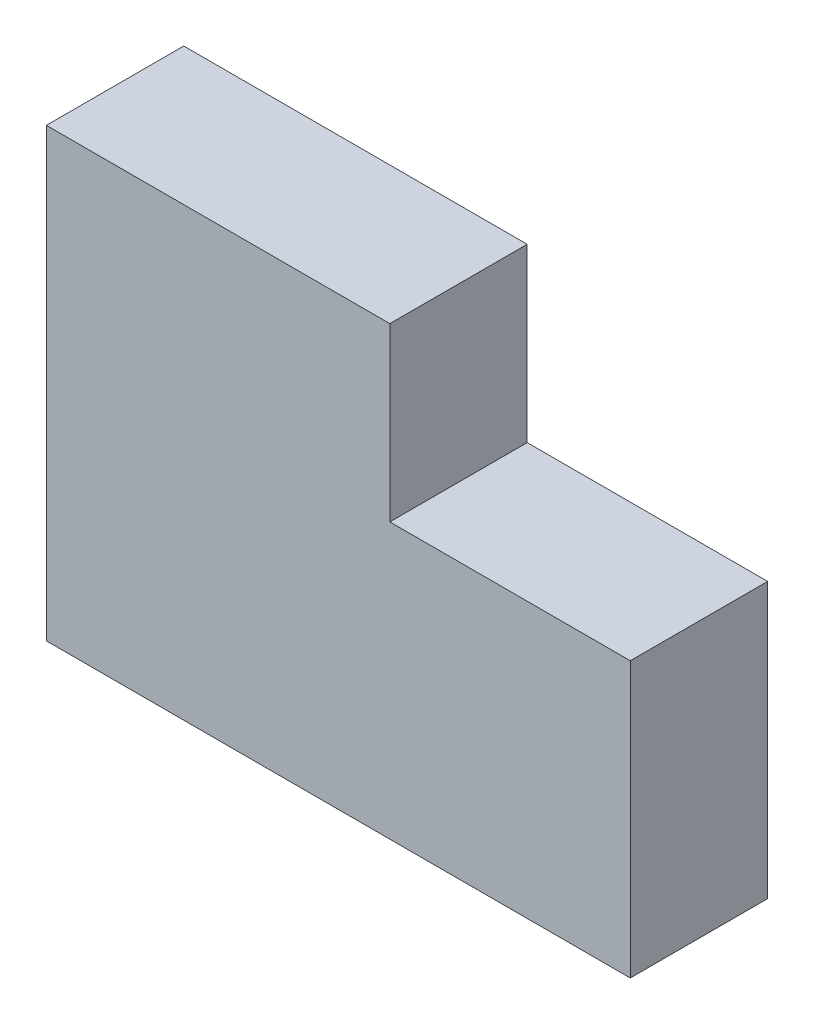
ISO-10303-21;
HEADER;
FILE_DESCRIPTION(('STEP AP214'),'2;1');
FILE_NAME('part.step','',(''),(''),'','','');
FILE_SCHEMA(('AUTOMOTIVE_DESIGN { 1 0 10303 214 1 1 1 1 }'));
ENDSEC;
DATA;
#1=APPLICATION_CONTEXT('core data for automotive mechanical design processes');
#2=APPLICATION_PROTOCOL_DEFINITION('international standard','automotive_design',2000,#1);
#3=PRODUCT_CONTEXT('',#1,'mechanical');
#4=PRODUCT('Part','Part','',(#3));
#5=PRODUCT_RELATED_PRODUCT_CATEGORY('part','',(#4));
#6=PRODUCT_DEFINITION_FORMATION('','',#4);
#7=PRODUCT_DEFINITION_CONTEXT('part definition',#1,'design');
#8=PRODUCT_DEFINITION('design','',#6,#7);
#9=PRODUCT_DEFINITION_SHAPE('','',#8);
#10=(LENGTH_UNIT() NAMED_UNIT(*) SI_UNIT(.MILLI.,.METRE.));
#11=(NAMED_UNIT(*) PLANE_ANGLE_UNIT() SI_UNIT($,.RADIAN.));
#12=(NAMED_UNIT(*) SI_UNIT($,.STERADIAN.) SOLID_ANGLE_UNIT());
#13=UNCERTAINTY_MEASURE_WITH_UNIT(LENGTH_MEASURE(1.E-05),#10,'distance_accuracy_value','');
#14=(GEOMETRIC_REPRESENTATION_CONTEXT(3) GLOBAL_UNCERTAINTY_ASSIGNED_CONTEXT((#13)) GLOBAL_UNIT_ASSIGNED_CONTEXT((#10,
#11,#12)) REPRESENTATION_CONTEXT('',''));
#15=CARTESIAN_POINT('',(0.,0.,0.));
#16=DIRECTION('',(0.,0.,1.));
#17=DIRECTION('',(1.,0.,0.));
#18=AXIS2_PLACEMENT_3D('',#15,#16,#17);
#19=CARTESIAN_POINT('',(0.,0.,20.));
#20=DIRECTION('',(1.,0.,0.));
#21=DIRECTION('',(0.,0.,-1.));
#22=AXIS2_PLACEMENT_3D('',#19,#20,#21);
#23=PLANE('',#22);
#24=DIRECTION('',(0.,-1.,0.));
#25=VECTOR('',#24,1.);
#26=CARTESIAN_POINT('',(0.,0.,0.));
#27=LINE('',#26,#25);
#28=CARTESIAN_POINT('',(0.,65.,0.));
#29=VERTEX_POINT('',#28);
#30=CARTESIAN_POINT('',(0.,0.,0.));
#31=VERTEX_POINT('',#30);
#32=EDGE_CURVE('E128',#29,#31,#27,.T.);
#33=ORIENTED_EDGE('',*,*,#32,.T.);
#34=DIRECTION('',(0.,0.,-1.));
#35=VECTOR('',#34,1.);
#36=CARTESIAN_POINT('',(0.,0.,20.));
#37=LINE('',#36,#35);
#38=CARTESIAN_POINT('',(0.,0.,20.));
#39=VERTEX_POINT('',#38);
#40=EDGE_CURVE('E11',#39,#31,#37,.T.);
#41=ORIENTED_EDGE('',*,*,#40,.F.);
#42=DIRECTION('',(0.,-1.,0.));
#43=VECTOR('',#42,1.);
#44=CARTESIAN_POINT('',(0.,0.,20.));
#45=LINE('',#44,#43);
#46=CARTESIAN_POINT('',(0.,65.,20.));
#47=VERTEX_POINT('',#46);
#48=EDGE_CURVE('E144',#47,#39,#45,.T.);
#49=ORIENTED_EDGE('',*,*,#48,.F.);
#50=DIRECTION('',(0.,0.,-1.));
#51=VECTOR('',#50,1.);
#52=CARTESIAN_POINT('',(0.,65.,20.));
#53=LINE('',#52,#51);
#54=EDGE_CURVE('E124',#47,#29,#53,.T.);
#55=ORIENTED_EDGE('',*,*,#54,.T.);
#56=EDGE_LOOP('',(#33,#41,#49,#55));
#57=FACE_BOUND('',#56,.T.);
#58=ADVANCED_FACE('F39',(#57),#23,.F.);
#59=CARTESIAN_POINT('',(0.,0.,20.));
#60=DIRECTION('',(0.,1.,0.));
#61=DIRECTION('',(0.,0.,1.));
#62=AXIS2_PLACEMENT_3D('',#59,#60,#61);
#63=PLANE('',#62);
#64=DIRECTION('',(1.,0.,0.));
#65=VECTOR('',#64,1.);
#66=CARTESIAN_POINT('',(0.,0.,0.));
#67=LINE('',#66,#65);
#68=CARTESIAN_POINT('',(85.,0.,0.));
#69=VERTEX_POINT('',#68);
#70=EDGE_CURVE('E132',#31,#69,#67,.T.);
#71=ORIENTED_EDGE('',*,*,#70,.T.);
#72=DIRECTION('',(0.,0.,-1.));
#73=VECTOR('',#72,1.);
#74=CARTESIAN_POINT('',(85.,0.,20.));
#75=LINE('',#74,#73);
#76=CARTESIAN_POINT('',(85.,0.,20.));
#77=VERTEX_POINT('',#76);
#78=EDGE_CURVE('E48',#77,#69,#75,.T.);
#79=ORIENTED_EDGE('',*,*,#78,.F.);
#80=DIRECTION('',(1.,0.,0.));
#81=VECTOR('',#80,1.);
#82=CARTESIAN_POINT('',(0.,0.,20.));
#83=LINE('',#82,#81);
#84=EDGE_CURVE('E93',#39,#77,#83,.T.);
#85=ORIENTED_EDGE('',*,*,#84,.F.);
#86=ORIENTED_EDGE('',*,*,#40,.T.);
#87=EDGE_LOOP('',(#71,#79,#85,#86));
#88=FACE_BOUND('',#87,.T.);
#89=ADVANCED_FACE('F172',(#88),#63,.F.);
#90=CARTESIAN_POINT('',(85.,0.,20.));
#91=DIRECTION('',(-1.,0.,0.));
#92=DIRECTION('',(0.,0.,1.));
#93=AXIS2_PLACEMENT_3D('',#90,#91,#92);
#94=PLANE('',#93);
#95=DIRECTION('',(0.,1.,0.));
#96=VECTOR('',#95,1.);
#97=CARTESIAN_POINT('',(85.,0.,0.));
#98=LINE('',#97,#96);
#99=CARTESIAN_POINT('',(85.,40.,0.));
#100=VERTEX_POINT('',#99);
#101=EDGE_CURVE('E135',#69,#100,#98,.T.);
#102=ORIENTED_EDGE('',*,*,#101,.T.);
#103=DIRECTION('',(0.,0.,-1.));
#104=VECTOR('',#103,1.);
#105=CARTESIAN_POINT('',(85.,40.,20.));
#106=LINE('',#105,#104);
#107=CARTESIAN_POINT('',(85.,40.,20.));
#108=VERTEX_POINT('',#107);
#109=EDGE_CURVE('E117',#108,#100,#106,.T.);
#110=ORIENTED_EDGE('',*,*,#109,.F.);
#111=DIRECTION('',(0.,1.,0.));
#112=VECTOR('',#111,1.);
#113=CARTESIAN_POINT('',(85.,0.,20.));
#114=LINE('',#113,#112);
#115=EDGE_CURVE('E106',#77,#108,#114,.T.);
#116=ORIENTED_EDGE('',*,*,#115,.F.);
#117=ORIENTED_EDGE('',*,*,#78,.T.);
#118=EDGE_LOOP('',(#102,#110,#116,#117));
#119=FACE_BOUND('',#118,.T.);
#120=ADVANCED_FACE('F154',(#119),#94,.F.);
#121=CARTESIAN_POINT('',(50.,40.,20.));
#122=DIRECTION('',(0.,-1.,0.));
#123=DIRECTION('',(0.,0.,-1.));
#124=AXIS2_PLACEMENT_3D('',#121,#122,#123);
#125=PLANE('',#124);
#126=DIRECTION('',(-1.,0.,0.));
#127=VECTOR('',#126,1.);
#128=CARTESIAN_POINT('',(50.,40.,0.));
#129=LINE('',#128,#127);
#130=CARTESIAN_POINT('',(50.,40.,0.));
#131=VERTEX_POINT('',#130);
#132=EDGE_CURVE('E115',#100,#131,#129,.T.);
#133=ORIENTED_EDGE('',*,*,#132,.T.);
#134=DIRECTION('',(0.,0.,-1.));
#135=VECTOR('',#134,1.);
#136=CARTESIAN_POINT('',(50.,40.,20.));
#137=LINE('',#136,#135);
#138=CARTESIAN_POINT('',(50.,40.,20.));
#139=VERTEX_POINT('',#138);
#140=EDGE_CURVE('E112',#139,#131,#137,.T.);
#141=ORIENTED_EDGE('',*,*,#140,.F.);
#142=DIRECTION('',(-1.,0.,0.));
#143=VECTOR('',#142,1.);
#144=CARTESIAN_POINT('',(50.,40.,20.));
#145=LINE('',#144,#143);
#146=EDGE_CURVE('E100',#108,#139,#145,.T.);
#147=ORIENTED_EDGE('',*,*,#146,.F.);
#148=ORIENTED_EDGE('',*,*,#109,.T.);
#149=EDGE_LOOP('',(#133,#141,#147,#148));
#150=FACE_BOUND('',#149,.T.);
#151=ADVANCED_FACE('F113',(#150),#125,.F.);
#152=CARTESIAN_POINT('',(50.,65.,20.));
#153=DIRECTION('',(-1.,0.,0.));
#154=DIRECTION('',(0.,0.,1.));
#155=AXIS2_PLACEMENT_3D('',#152,#153,#154);
#156=PLANE('',#155);
#157=DIRECTION('',(0.,1.,0.));
#158=VECTOR('',#157,1.);
#159=CARTESIAN_POINT('',(50.,65.,0.));
#160=LINE('',#159,#158);
#161=CARTESIAN_POINT('',(50.,65.,0.));
#162=VERTEX_POINT('',#161);
#163=EDGE_CURVE('E79',#131,#162,#160,.T.);
#164=ORIENTED_EDGE('',*,*,#163,.T.);
#165=DIRECTION('',(0.,0.,-1.));
#166=VECTOR('',#165,1.);
#167=CARTESIAN_POINT('',(50.,65.,20.));
#168=LINE('',#167,#166);
#169=CARTESIAN_POINT('',(50.,65.,20.));
#170=VERTEX_POINT('',#169);
#171=EDGE_CURVE('E118',#170,#162,#168,.T.);
#172=ORIENTED_EDGE('',*,*,#171,.F.);
#173=DIRECTION('',(0.,1.,0.));
#174=VECTOR('',#173,1.);
#175=CARTESIAN_POINT('',(50.,65.,20.));
#176=LINE('',#175,#174);
#177=EDGE_CURVE('E104',#139,#170,#176,.T.);
#178=ORIENTED_EDGE('',*,*,#177,.F.);
#179=ORIENTED_EDGE('',*,*,#140,.T.);
#180=EDGE_LOOP('',(#164,#172,#178,#179));
#181=FACE_BOUND('',#180,.T.);
#182=ADVANCED_FACE('F120',(#181),#156,.F.);
#183=CARTESIAN_POINT('',(0.,65.,20.));
#184=DIRECTION('',(0.,-1.,0.));
#185=DIRECTION('',(0.,0.,-1.));
#186=AXIS2_PLACEMENT_3D('',#183,#184,#185);
#187=PLANE('',#186);
#188=DIRECTION('',(-1.,0.,0.));
#189=VECTOR('',#188,1.);
#190=CARTESIAN_POINT('',(0.,65.,0.));
#191=LINE('',#190,#189);
#192=EDGE_CURVE('E85',#162,#29,#191,.T.);
#193=ORIENTED_EDGE('',*,*,#192,.T.);
#194=ORIENTED_EDGE('',*,*,#54,.F.);
#195=DIRECTION('',(-1.,0.,0.));
#196=VECTOR('',#195,1.);
#197=CARTESIAN_POINT('',(0.,65.,20.));
#198=LINE('',#197,#196);
#199=EDGE_CURVE('E56',#170,#47,#198,.T.);
#200=ORIENTED_EDGE('',*,*,#199,.F.);
#201=ORIENTED_EDGE('',*,*,#171,.T.);
#202=EDGE_LOOP('',(#193,#194,#200,#201));
#203=FACE_BOUND('',#202,.T.);
#204=ADVANCED_FACE('F161',(#203),#187,.F.);
#205=CARTESIAN_POINT('',(0.,0.,20.));
#206=DIRECTION('',(0.,0.,-1.));
#207=DIRECTION('',(-1.,0.,0.));
#208=AXIS2_PLACEMENT_3D('',#205,#206,#207);
#209=PLANE('',#208);
#210=ORIENTED_EDGE('',*,*,#48,.T.);
#211=ORIENTED_EDGE('',*,*,#84,.T.);
#212=ORIENTED_EDGE('',*,*,#115,.T.);
#213=ORIENTED_EDGE('',*,*,#146,.T.);
#214=ORIENTED_EDGE('',*,*,#177,.T.);
#215=ORIENTED_EDGE('',*,*,#199,.T.);
#216=EDGE_LOOP('',(#210,#211,#212,#213,#214,#215));
#217=FACE_BOUND('',#216,.T.);
#218=ADVANCED_FACE('F102',(#217),#209,.F.);
#219=CARTESIAN_POINT('',(0.,0.,0.));
#220=DIRECTION('',(0.,0.,-1.));
#221=DIRECTION('',(-1.,0.,0.));
#222=AXIS2_PLACEMENT_3D('',#219,#220,#221);
#223=PLANE('',#222);
#224=ORIENTED_EDGE('',*,*,#32,.F.);
#225=ORIENTED_EDGE('',*,*,#192,.F.);
#226=ORIENTED_EDGE('',*,*,#163,.F.);
#227=ORIENTED_EDGE('',*,*,#132,.F.);
#228=ORIENTED_EDGE('',*,*,#101,.F.);
#229=ORIENTED_EDGE('',*,*,#70,.F.);
#230=EDGE_LOOP('',(#224,#225,#226,#227,#228,#229));
#231=FACE_BOUND('',#230,.T.);
#232=ADVANCED_FACE('F157',(#231),#223,.T.);
#233=CLOSED_SHELL('',(#58,#89,#120,#151,#182,#204,#218,#232));
#234=MANIFOLD_SOLID_BREP('B2',#233);
#235=ADVANCED_BREP_SHAPE_REPRESENTATION('',(#18,#234),#14);
#236=SHAPE_DEFINITION_REPRESENTATION(#9,#235);
ENDSEC;
END-ISO-10303-21;
